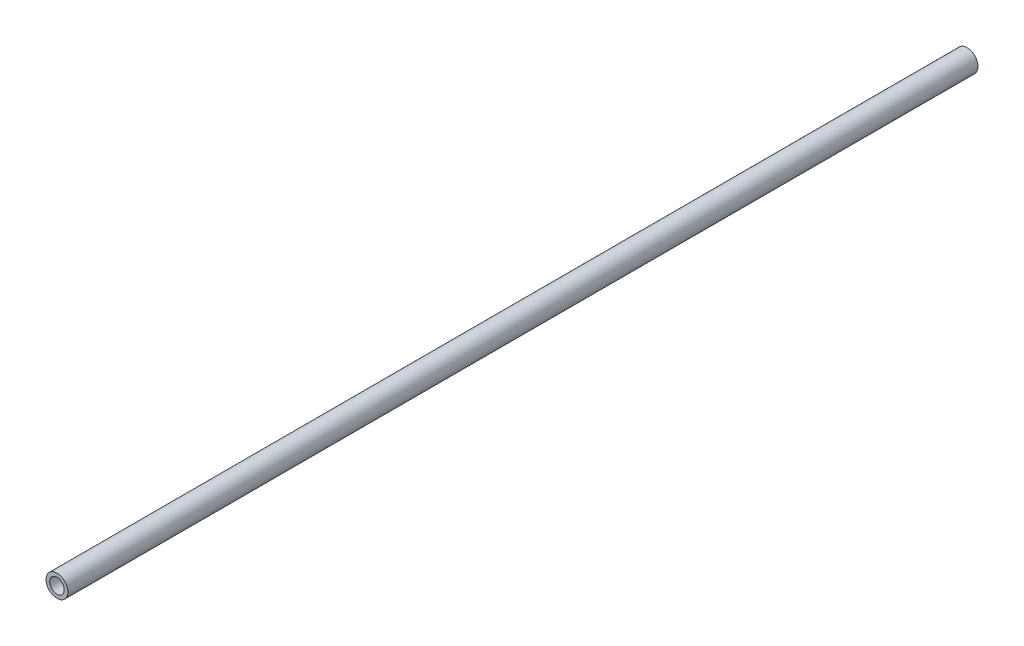
ISO-10303-21;
HEADER;
FILE_DESCRIPTION(('STEP AP214'),'2;1');
FILE_NAME('part.step','',(''),(''),'','','');
FILE_SCHEMA(('AUTOMOTIVE_DESIGN { 1 0 10303 214 1 1 1 1 }'));
ENDSEC;
DATA;
#1=APPLICATION_CONTEXT('core data for automotive mechanical design processes');
#2=APPLICATION_PROTOCOL_DEFINITION('international standard','automotive_design',2000,#1);
#3=PRODUCT_CONTEXT('',#1,'mechanical');
#4=PRODUCT('Part','Part','',(#3));
#5=PRODUCT_RELATED_PRODUCT_CATEGORY('part','',(#4));
#6=PRODUCT_DEFINITION_FORMATION('','',#4);
#7=PRODUCT_DEFINITION_CONTEXT('part definition',#1,'design');
#8=PRODUCT_DEFINITION('design','',#6,#7);
#9=PRODUCT_DEFINITION_SHAPE('','',#8);
#10=(LENGTH_UNIT() NAMED_UNIT(*) SI_UNIT(.MILLI.,.METRE.));
#11=(NAMED_UNIT(*) PLANE_ANGLE_UNIT() SI_UNIT($,.RADIAN.));
#12=(NAMED_UNIT(*) SI_UNIT($,.STERADIAN.) SOLID_ANGLE_UNIT());
#13=UNCERTAINTY_MEASURE_WITH_UNIT(LENGTH_MEASURE(1.E-05),#10,'distance_accuracy_value','');
#14=(GEOMETRIC_REPRESENTATION_CONTEXT(3) GLOBAL_UNCERTAINTY_ASSIGNED_CONTEXT((#13)) GLOBAL_UNIT_ASSIGNED_CONTEXT((#10,
#11,#12)) REPRESENTATION_CONTEXT('',''));
#15=CARTESIAN_POINT('',(0.,0.,0.));
#16=DIRECTION('',(0.,0.,1.));
#17=DIRECTION('',(1.,0.,0.));
#18=AXIS2_PLACEMENT_3D('',#15,#16,#17);
#19=CARTESIAN_POINT('',(0.,0.,249.5));
#20=DIRECTION('',(0.,0.,1.));
#21=DIRECTION('',(1.,0.,0.));
#22=AXIS2_PLACEMENT_3D('',#19,#20,#21);
#23=PLANE('',#22);
#24=CARTESIAN_POINT('',(0.,0.,249.5));
#25=DIRECTION('',(0.,0.,1.));
#26=DIRECTION('',(1.,0.,0.));
#27=AXIS2_PLACEMENT_3D('',#24,#25,#26);
#28=CIRCLE('',#27,3.);
#29=CARTESIAN_POINT('',(-3.,0.,249.5));
#30=VERTEX_POINT('',#29);
#31=EDGE_CURVE('E11',#30,#30,#28,.T.);
#32=ORIENTED_EDGE('',*,*,#31,.T.);
#33=EDGE_LOOP('',(#32));
#34=FACE_BOUND('',#33,.T.);
#35=CARTESIAN_POINT('',(0.,0.,249.5));
#36=DIRECTION('',(0.,0.,1.));
#37=DIRECTION('',(1.,0.,0.));
#38=AXIS2_PLACEMENT_3D('',#35,#36,#37);
#39=CIRCLE('',#38,2.);
#40=CARTESIAN_POINT('',(-2.,0.,249.5));
#41=VERTEX_POINT('',#40);
#42=EDGE_CURVE('E48',#41,#41,#39,.T.);
#43=ORIENTED_EDGE('',*,*,#42,.F.);
#44=EDGE_LOOP('',(#43));
#45=FACE_BOUND('',#44,.T.);
#46=ADVANCED_FACE('F37',(#34,#45),#23,.T.);
#47=CARTESIAN_POINT('',(0.,0.,0.));
#48=DIRECTION('',(0.,0.,1.));
#49=DIRECTION('',(1.,0.,0.));
#50=AXIS2_PLACEMENT_3D('',#47,#48,#49);
#51=PLANE('',#50);
#52=CARTESIAN_POINT('',(0.,0.,0.));
#53=DIRECTION('',(0.,0.,1.));
#54=DIRECTION('',(1.,0.,0.));
#55=AXIS2_PLACEMENT_3D('',#52,#53,#54);
#56=CIRCLE('',#55,3.);
#57=CARTESIAN_POINT('',(-3.,0.,0.));
#58=VERTEX_POINT('',#57);
#59=EDGE_CURVE('E41',#58,#58,#56,.T.);
#60=ORIENTED_EDGE('',*,*,#59,.F.);
#61=EDGE_LOOP('',(#60));
#62=FACE_BOUND('',#61,.T.);
#63=CARTESIAN_POINT('',(0.,0.,0.));
#64=DIRECTION('',(0.,0.,1.));
#65=DIRECTION('',(1.,0.,0.));
#66=AXIS2_PLACEMENT_3D('',#63,#64,#65);
#67=CIRCLE('',#66,2.);
#68=CARTESIAN_POINT('',(-2.,0.,0.));
#69=VERTEX_POINT('',#68);
#70=EDGE_CURVE('E50',#69,#69,#67,.T.);
#71=ORIENTED_EDGE('',*,*,#70,.T.);
#72=EDGE_LOOP('',(#71));
#73=FACE_BOUND('',#72,.T.);
#74=ADVANCED_FACE('F60',(#62,#73),#51,.F.);
#75=CARTESIAN_POINT('',(0.,0.,249.5));
#76=DIRECTION('',(0.,0.,-1.));
#77=DIRECTION('',(-1.,0.,0.));
#78=AXIS2_PLACEMENT_3D('',#75,#76,#77);
#79=CYLINDRICAL_SURFACE('',#78,3.);
#80=CARTESIAN_POINT('',(-3.,0.,249.5));
#81=CARTESIAN_POINT('',(-3.,0.,246.901041666667));
#82=CARTESIAN_POINT('',(-3.,0.,244.302083333333));
#83=CARTESIAN_POINT('',(-3.,0.,239.104166666667));
#84=CARTESIAN_POINT('',(-3.,0.,236.505208333333));
#85=CARTESIAN_POINT('',(-3.,0.,231.307291666667));
#86=CARTESIAN_POINT('',(-3.,0.,228.708333333333));
#87=CARTESIAN_POINT('',(-3.,0.,223.510416666667));
#88=CARTESIAN_POINT('',(-3.,0.,220.911458333333));
#89=CARTESIAN_POINT('',(-3.,0.,215.713541666667));
#90=CARTESIAN_POINT('',(-3.,0.,213.114583333333));
#91=CARTESIAN_POINT('',(-3.,0.,207.916666666667));
#92=CARTESIAN_POINT('',(-3.,0.,205.317708333333));
#93=CARTESIAN_POINT('',(-3.,0.,200.119791666667));
#94=CARTESIAN_POINT('',(-3.,0.,197.520833333333));
#95=CARTESIAN_POINT('',(-3.,0.,192.322916666667));
#96=CARTESIAN_POINT('',(-3.,0.,189.723958333333));
#97=CARTESIAN_POINT('',(-3.,0.,184.526041666667));
#98=CARTESIAN_POINT('',(-3.,0.,181.927083333333));
#99=CARTESIAN_POINT('',(-3.,0.,176.729166666667));
#100=CARTESIAN_POINT('',(-3.,0.,174.130208333333));
#101=CARTESIAN_POINT('',(-3.,0.,168.932291666667));
#102=CARTESIAN_POINT('',(-3.,0.,166.333333333333));
#103=CARTESIAN_POINT('',(-3.,0.,161.135416666667));
#104=CARTESIAN_POINT('',(-3.,0.,158.536458333333));
#105=CARTESIAN_POINT('',(-3.,0.,153.338541666667));
#106=CARTESIAN_POINT('',(-3.,0.,150.739583333333));
#107=CARTESIAN_POINT('',(-3.,0.,145.541666666667));
#108=CARTESIAN_POINT('',(-3.,0.,142.942708333333));
#109=CARTESIAN_POINT('',(-3.,0.,137.744791666667));
#110=CARTESIAN_POINT('',(-3.,0.,135.145833333333));
#111=CARTESIAN_POINT('',(-3.,0.,129.947916666667));
#112=CARTESIAN_POINT('',(-3.,0.,127.348958333333));
#113=CARTESIAN_POINT('',(-3.,0.,122.151041666667));
#114=CARTESIAN_POINT('',(-3.,0.,119.552083333333));
#115=CARTESIAN_POINT('',(-3.,0.,114.354166666667));
#116=CARTESIAN_POINT('',(-3.,0.,111.755208333333));
#117=CARTESIAN_POINT('',(-3.,0.,106.557291666667));
#118=CARTESIAN_POINT('',(-3.,0.,103.958333333333));
#119=CARTESIAN_POINT('',(-3.,0.,98.7604166666666));
#120=CARTESIAN_POINT('',(-3.,0.,96.1614583333333));
#121=CARTESIAN_POINT('',(-3.,0.,90.9635416666667));
#122=CARTESIAN_POINT('',(-3.,0.,88.3645833333333));
#123=CARTESIAN_POINT('',(-3.,0.,83.1666666666667));
#124=CARTESIAN_POINT('',(-3.,0.,80.5677083333333));
#125=CARTESIAN_POINT('',(-3.,0.,75.3697916666666));
#126=CARTESIAN_POINT('',(-3.,0.,72.7708333333333));
#127=CARTESIAN_POINT('',(-3.,0.,67.5729166666666));
#128=CARTESIAN_POINT('',(-3.,0.,64.9739583333333));
#129=CARTESIAN_POINT('',(-3.,0.,59.7760416666667));
#130=CARTESIAN_POINT('',(-3.,0.,57.1770833333333));
#131=CARTESIAN_POINT('',(-3.,0.,51.9791666666666));
#132=CARTESIAN_POINT('',(-3.,0.,49.3802083333333));
#133=CARTESIAN_POINT('',(-3.,0.,44.1822916666666));
#134=CARTESIAN_POINT('',(-3.,0.,41.5833333333333));
#135=CARTESIAN_POINT('',(-3.,0.,36.3854166666667));
#136=CARTESIAN_POINT('',(-3.,0.,33.7864583333333));
#137=CARTESIAN_POINT('',(-3.,0.,28.5885416666666));
#138=CARTESIAN_POINT('',(-3.,0.,25.9895833333333));
#139=CARTESIAN_POINT('',(-3.,0.,20.7916666666666));
#140=CARTESIAN_POINT('',(-3.,0.,18.1927083333333));
#141=CARTESIAN_POINT('',(-3.,0.,12.9947916666666));
#142=CARTESIAN_POINT('',(-3.,0.,10.3958333333333));
#143=CARTESIAN_POINT('',(-3.,0.,5.19791666666664));
#144=CARTESIAN_POINT('',(-3.,0.,2.59895833333331));
#145=CARTESIAN_POINT('',(-3.,0.,0.));
#146=B_SPLINE_CURVE_WITH_KNOTS('',3,(#80,#81,#82,#83,#84,#85,#86,#87,#88,#89,#90,#91,#92,#93,
#94,#95,#96,#97,#98,#99,#100,#101,#102,#103,#104,#105,#106,#107,#108,#109,#110,#111,#112,#113,
#114,#115,#116,#117,#118,#119,#120,#121,#122,#123,#124,#125,#126,#127,#128,#129,#130,#131,#132,
#133,#134,#135,#136,#137,#138,#139,#140,#141,#142,#143,#144,#145),.UNSPECIFIED.,.F.,.F.,(4,2,2,
2,2,2,2,2,2,2,2,2,2,2,2,2,2,2,2,2,2,2,2,2,2,2,2,2,2,2,2,2,4),(0.,7.79687499999998,15.59375,
23.390625,31.1875,38.984375,46.78125,54.578125,62.375,70.171875,77.96875,85.765625,93.5625,
101.359375,109.15625,116.953125,124.75,132.546875,140.34375,148.140625,155.9375,163.734375,
171.53125,179.328125,187.125,194.921875,202.71875,210.515625,218.3125,226.109375,233.90625,
241.703125,249.5),.UNSPECIFIED.);
#147=EDGE_CURVE('BSEAM39',#30,#58,#146,.T.);
#148=ORIENTED_EDGE('',*,*,#31,.F.);
#149=ORIENTED_EDGE('',*,*,#59,.T.);
#150=ORIENTED_EDGE('',*,*,#147,.T.);
#151=ORIENTED_EDGE('',*,*,#147,.F.);
#152=EDGE_LOOP('',(#148,#150,#149,#151));
#153=FACE_BOUND('',#152,.T.);
#154=ADVANCED_FACE('F39',(#153),#79,.T.);
#155=CARTESIAN_POINT('',(0.,0.,249.5));
#156=DIRECTION('',(0.,0.,-1.));
#157=DIRECTION('',(-1.,0.,0.));
#158=AXIS2_PLACEMENT_3D('',#155,#156,#157);
#159=CYLINDRICAL_SURFACE('',#158,2.);
#160=CARTESIAN_POINT('',(-2.,0.,249.5));
#161=CARTESIAN_POINT('',(-2.,0.,246.901041666667));
#162=CARTESIAN_POINT('',(-2.,0.,244.302083333333));
#163=CARTESIAN_POINT('',(-2.,0.,239.104166666667));
#164=CARTESIAN_POINT('',(-2.,0.,236.505208333333));
#165=CARTESIAN_POINT('',(-2.,0.,231.307291666667));
#166=CARTESIAN_POINT('',(-2.,0.,228.708333333333));
#167=CARTESIAN_POINT('',(-2.,0.,223.510416666667));
#168=CARTESIAN_POINT('',(-2.,0.,220.911458333333));
#169=CARTESIAN_POINT('',(-2.,0.,215.713541666667));
#170=CARTESIAN_POINT('',(-2.,0.,213.114583333333));
#171=CARTESIAN_POINT('',(-2.,0.,207.916666666667));
#172=CARTESIAN_POINT('',(-2.,0.,205.317708333333));
#173=CARTESIAN_POINT('',(-2.,0.,200.119791666667));
#174=CARTESIAN_POINT('',(-2.,0.,197.520833333333));
#175=CARTESIAN_POINT('',(-2.,0.,192.322916666667));
#176=CARTESIAN_POINT('',(-2.,0.,189.723958333333));
#177=CARTESIAN_POINT('',(-2.,0.,184.526041666667));
#178=CARTESIAN_POINT('',(-2.,0.,181.927083333333));
#179=CARTESIAN_POINT('',(-2.,0.,176.729166666667));
#180=CARTESIAN_POINT('',(-2.,0.,174.130208333333));
#181=CARTESIAN_POINT('',(-2.,0.,168.932291666667));
#182=CARTESIAN_POINT('',(-2.,0.,166.333333333333));
#183=CARTESIAN_POINT('',(-2.,0.,161.135416666667));
#184=CARTESIAN_POINT('',(-2.,0.,158.536458333333));
#185=CARTESIAN_POINT('',(-2.,0.,153.338541666667));
#186=CARTESIAN_POINT('',(-2.,0.,150.739583333333));
#187=CARTESIAN_POINT('',(-2.,0.,145.541666666667));
#188=CARTESIAN_POINT('',(-2.,0.,142.942708333333));
#189=CARTESIAN_POINT('',(-2.,0.,137.744791666667));
#190=CARTESIAN_POINT('',(-2.,0.,135.145833333333));
#191=CARTESIAN_POINT('',(-2.,0.,129.947916666667));
#192=CARTESIAN_POINT('',(-2.,0.,127.348958333333));
#193=CARTESIAN_POINT('',(-2.,0.,122.151041666667));
#194=CARTESIAN_POINT('',(-2.,0.,119.552083333333));
#195=CARTESIAN_POINT('',(-2.,0.,114.354166666667));
#196=CARTESIAN_POINT('',(-2.,0.,111.755208333333));
#197=CARTESIAN_POINT('',(-2.,0.,106.557291666667));
#198=CARTESIAN_POINT('',(-2.,0.,103.958333333333));
#199=CARTESIAN_POINT('',(-2.,0.,98.7604166666666));
#200=CARTESIAN_POINT('',(-2.,0.,96.1614583333333));
#201=CARTESIAN_POINT('',(-2.,0.,90.9635416666667));
#202=CARTESIAN_POINT('',(-2.,0.,88.3645833333333));
#203=CARTESIAN_POINT('',(-2.,0.,83.1666666666667));
#204=CARTESIAN_POINT('',(-2.,0.,80.5677083333333));
#205=CARTESIAN_POINT('',(-2.,0.,75.3697916666666));
#206=CARTESIAN_POINT('',(-2.,0.,72.7708333333333));
#207=CARTESIAN_POINT('',(-2.,0.,67.5729166666666));
#208=CARTESIAN_POINT('',(-2.,0.,64.9739583333333));
#209=CARTESIAN_POINT('',(-2.,0.,59.7760416666667));
#210=CARTESIAN_POINT('',(-2.,0.,57.1770833333333));
#211=CARTESIAN_POINT('',(-2.,0.,51.9791666666666));
#212=CARTESIAN_POINT('',(-2.,0.,49.3802083333333));
#213=CARTESIAN_POINT('',(-2.,0.,44.1822916666666));
#214=CARTESIAN_POINT('',(-2.,0.,41.5833333333333));
#215=CARTESIAN_POINT('',(-2.,0.,36.3854166666667));
#216=CARTESIAN_POINT('',(-2.,0.,33.7864583333333));
#217=CARTESIAN_POINT('',(-2.,0.,28.5885416666666));
#218=CARTESIAN_POINT('',(-2.,0.,25.9895833333333));
#219=CARTESIAN_POINT('',(-2.,0.,20.7916666666666));
#220=CARTESIAN_POINT('',(-2.,0.,18.1927083333333));
#221=CARTESIAN_POINT('',(-2.,0.,12.9947916666666));
#222=CARTESIAN_POINT('',(-2.,0.,10.3958333333333));
#223=CARTESIAN_POINT('',(-2.,0.,5.19791666666664));
#224=CARTESIAN_POINT('',(-2.,0.,2.59895833333331));
#225=CARTESIAN_POINT('',(-2.,0.,0.));
#226=B_SPLINE_CURVE_WITH_KNOTS('',3,(#160,#161,#162,#163,#164,#165,#166,#167,#168,#169,#170,
#171,#172,#173,#174,#175,#176,#177,#178,#179,#180,#181,#182,#183,#184,#185,#186,#187,#188,#189,
#190,#191,#192,#193,#194,#195,#196,#197,#198,#199,#200,#201,#202,#203,#204,#205,#206,#207,#208,
#209,#210,#211,#212,#213,#214,#215,#216,#217,#218,#219,#220,#221,#222,#223,#224,#225),
.UNSPECIFIED.,.F.,.F.,(4,2,2,2,2,2,2,2,2,2,2,2,2,2,2,2,2,2,2,2,2,2,2,2,2,2,2,2,2,2,2,2,4),(0.,
7.79687499999998,15.59375,23.390625,31.1875,38.984375,46.78125,54.578125,62.375,70.171875,
77.96875,85.765625,93.5625,101.359375,109.15625,116.953125,124.75,132.546875,140.34375,
148.140625,155.9375,163.734375,171.53125,179.328125,187.125,194.921875,202.71875,210.515625,
218.3125,226.109375,233.90625,241.703125,249.5),.UNSPECIFIED.);
#227=EDGE_CURVE('BSEAM56',#41,#69,#226,.T.);
#228=ORIENTED_EDGE('',*,*,#42,.T.);
#229=ORIENTED_EDGE('',*,*,#70,.F.);
#230=ORIENTED_EDGE('',*,*,#227,.T.);
#231=ORIENTED_EDGE('',*,*,#227,.F.);
#232=EDGE_LOOP('',(#228,#230,#229,#231));
#233=FACE_BOUND('',#232,.T.);
#234=ADVANCED_FACE('F56',(#233),#159,.F.);
#235=CLOSED_SHELL('',(#46,#74,#154,#234));
#236=MANIFOLD_SOLID_BREP('B2',#235);
#237=ADVANCED_BREP_SHAPE_REPRESENTATION('',(#18,#236),#14);
#238=SHAPE_DEFINITION_REPRESENTATION(#9,#237);
ENDSEC;
END-ISO-10303-21;
